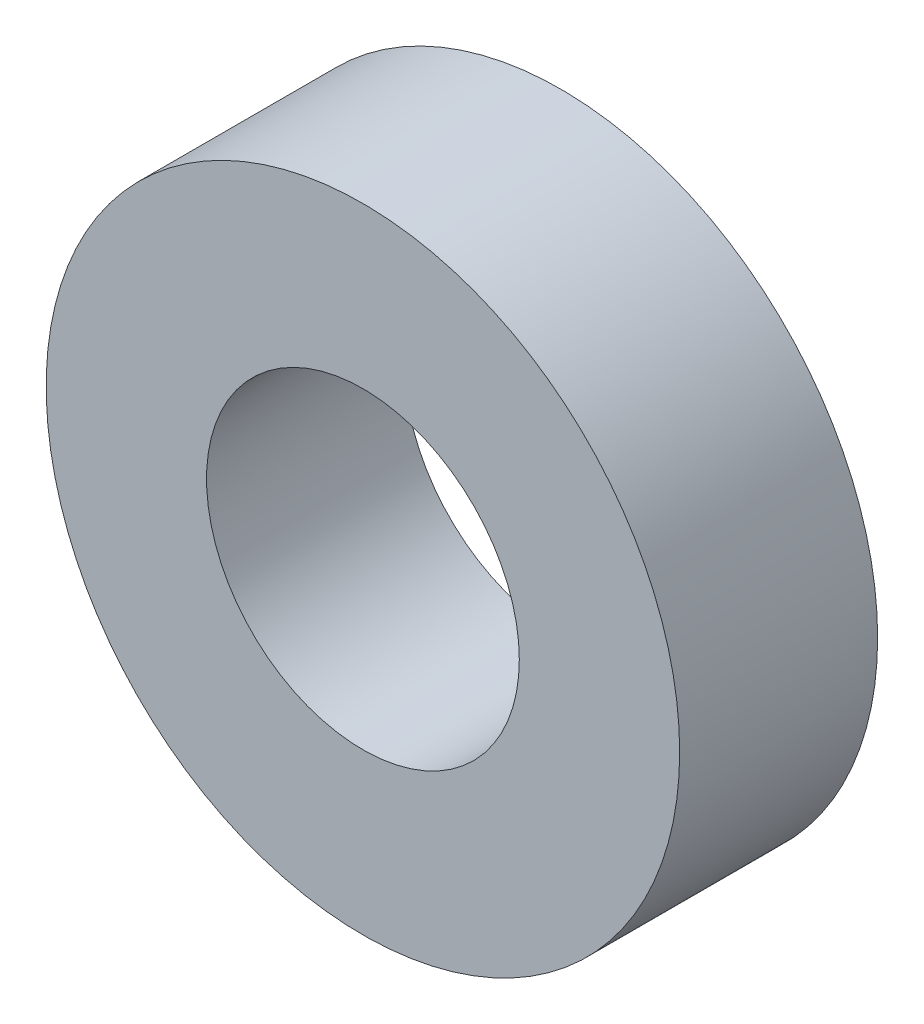
ISO-10303-21;
HEADER;
FILE_DESCRIPTION(('STEP AP214'),'2;1');
FILE_NAME('part.step','',(''),(''),'','','');
FILE_SCHEMA(('AUTOMOTIVE_DESIGN { 1 0 10303 214 1 1 1 1 }'));
ENDSEC;
DATA;
#1=APPLICATION_CONTEXT('core data for automotive mechanical design processes');
#2=APPLICATION_PROTOCOL_DEFINITION('international standard','automotive_design',2000,#1);
#3=PRODUCT_CONTEXT('',#1,'mechanical');
#4=PRODUCT('Part','Part','',(#3));
#5=PRODUCT_RELATED_PRODUCT_CATEGORY('part','',(#4));
#6=PRODUCT_DEFINITION_FORMATION('','',#4);
#7=PRODUCT_DEFINITION_CONTEXT('part definition',#1,'design');
#8=PRODUCT_DEFINITION('design','',#6,#7);
#9=PRODUCT_DEFINITION_SHAPE('','',#8);
#10=(LENGTH_UNIT() NAMED_UNIT(*) SI_UNIT(.MILLI.,.METRE.));
#11=(NAMED_UNIT(*) PLANE_ANGLE_UNIT() SI_UNIT($,.RADIAN.));
#12=(NAMED_UNIT(*) SI_UNIT($,.STERADIAN.) SOLID_ANGLE_UNIT());
#13=UNCERTAINTY_MEASURE_WITH_UNIT(LENGTH_MEASURE(1.E-05),#10,'distance_accuracy_value','');
#14=(GEOMETRIC_REPRESENTATION_CONTEXT(3) GLOBAL_UNCERTAINTY_ASSIGNED_CONTEXT((#13)) GLOBAL_UNIT_ASSIGNED_CONTEXT((#10,
#11,#12)) REPRESENTATION_CONTEXT('',''));
#15=CARTESIAN_POINT('',(0.,0.,0.));
#16=DIRECTION('',(0.,0.,1.));
#17=DIRECTION('',(1.,0.,0.));
#18=AXIS2_PLACEMENT_3D('',#15,#16,#17);
#19=CARTESIAN_POINT('',(0.,0.,5.));
#20=DIRECTION('',(0.,0.,1.));
#21=DIRECTION('',(1.,0.,0.));
#22=AXIS2_PLACEMENT_3D('',#19,#20,#21);
#23=PLANE('',#22);
#24=CARTESIAN_POINT('',(0.,0.,5.));
#25=DIRECTION('',(0.,0.,1.));
#26=DIRECTION('',(1.,0.,0.));
#27=AXIS2_PLACEMENT_3D('',#24,#25,#26);
#28=CIRCLE('',#27,8.);
#29=CARTESIAN_POINT('',(8.,0.,5.));
#30=VERTEX_POINT('',#29);
#31=EDGE_CURVE('E10',#30,#30,#28,.T.);
#32=ORIENTED_EDGE('',*,*,#31,.T.);
#33=EDGE_LOOP('',(#32));
#34=FACE_BOUND('',#33,.T.);
#35=CARTESIAN_POINT('',(0.,0.,5.));
#36=DIRECTION('',(0.,0.,1.));
#37=DIRECTION('',(1.,0.,0.));
#38=AXIS2_PLACEMENT_3D('',#35,#36,#37);
#39=CIRCLE('',#38,3.95);
#40=CARTESIAN_POINT('',(3.95,0.,5.));
#41=VERTEX_POINT('',#40);
#42=EDGE_CURVE('E43',#41,#41,#39,.T.);
#43=ORIENTED_EDGE('',*,*,#42,.F.);
#44=EDGE_LOOP('',(#43));
#45=FACE_BOUND('',#44,.T.);
#46=ADVANCED_FACE('F32',(#34,#45),#23,.T.);
#47=CARTESIAN_POINT('',(0.,0.,0.));
#48=DIRECTION('',(0.,0.,1.));
#49=DIRECTION('',(1.,0.,0.));
#50=AXIS2_PLACEMENT_3D('',#47,#48,#49);
#51=PLANE('',#50);
#52=CARTESIAN_POINT('',(0.,0.,0.));
#53=DIRECTION('',(0.,0.,1.));
#54=DIRECTION('',(1.,0.,0.));
#55=AXIS2_PLACEMENT_3D('',#52,#53,#54);
#56=CIRCLE('',#55,8.);
#57=CARTESIAN_POINT('',(8.,0.,0.));
#58=VERTEX_POINT('',#57);
#59=EDGE_CURVE('E36',#58,#58,#56,.T.);
#60=ORIENTED_EDGE('',*,*,#59,.F.);
#61=EDGE_LOOP('',(#60));
#62=FACE_BOUND('',#61,.T.);
#63=CARTESIAN_POINT('',(0.,0.,0.));
#64=DIRECTION('',(0.,0.,1.));
#65=DIRECTION('',(1.,0.,0.));
#66=AXIS2_PLACEMENT_3D('',#63,#64,#65);
#67=CIRCLE('',#66,3.95);
#68=CARTESIAN_POINT('',(3.95,0.,0.));
#69=VERTEX_POINT('',#68);
#70=EDGE_CURVE('E45',#69,#69,#67,.T.);
#71=ORIENTED_EDGE('',*,*,#70,.T.);
#72=EDGE_LOOP('',(#71));
#73=FACE_BOUND('',#72,.T.);
#74=ADVANCED_FACE('F55',(#62,#73),#51,.F.);
#75=CARTESIAN_POINT('',(0.,0.,5.));
#76=DIRECTION('',(0.,0.,-1.));
#77=DIRECTION('',(-1.,0.,0.));
#78=AXIS2_PLACEMENT_3D('',#75,#76,#77);
#79=CYLINDRICAL_SURFACE('',#78,8.);
#80=ORIENTED_EDGE('',*,*,#31,.F.);
#81=EDGE_LOOP('',(#80));
#82=FACE_BOUND('',#81,.T.);
#83=ORIENTED_EDGE('',*,*,#59,.T.);
#84=EDGE_LOOP('',(#83));
#85=FACE_BOUND('',#84,.T.);
#86=ADVANCED_FACE('F34',(#82,#85),#79,.T.);
#87=CARTESIAN_POINT('',(0.,0.,5.));
#88=DIRECTION('',(0.,0.,-1.));
#89=DIRECTION('',(-1.,0.,0.));
#90=AXIS2_PLACEMENT_3D('',#87,#88,#89);
#91=CYLINDRICAL_SURFACE('',#90,3.95);
#92=ORIENTED_EDGE('',*,*,#42,.T.);
#93=EDGE_LOOP('',(#92));
#94=FACE_BOUND('',#93,.T.);
#95=ORIENTED_EDGE('',*,*,#70,.F.);
#96=EDGE_LOOP('',(#95));
#97=FACE_BOUND('',#96,.T.);
#98=ADVANCED_FACE('F51',(#94,#97),#91,.F.);
#99=CLOSED_SHELL('',(#46,#74,#86,#98));
#100=MANIFOLD_SOLID_BREP('B2',#99);
#101=ADVANCED_BREP_SHAPE_REPRESENTATION('',(#18,#100),#14);
#102=SHAPE_DEFINITION_REPRESENTATION(#9,#101);
ENDSEC;
END-ISO-10303-21;
